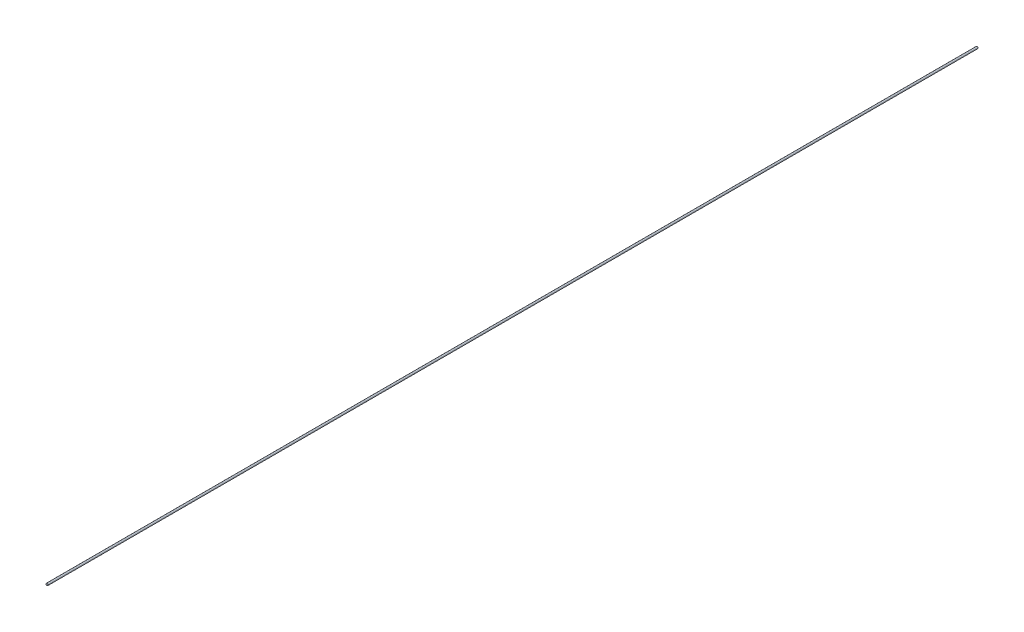
ISO-10303-21;
HEADER;
FILE_DESCRIPTION(('STEP AP214'),'2;1');
FILE_NAME('part.step','',(''),(''),'','','');
FILE_SCHEMA(('AUTOMOTIVE_DESIGN { 1 0 10303 214 1 1 1 1 }'));
ENDSEC;
DATA;
#1=APPLICATION_CONTEXT('core data for automotive mechanical design processes');
#2=APPLICATION_PROTOCOL_DEFINITION('international standard','automotive_design',2000,#1);
#3=PRODUCT_CONTEXT('',#1,'mechanical');
#4=PRODUCT('Part','Part','',(#3));
#5=PRODUCT_RELATED_PRODUCT_CATEGORY('part','',(#4));
#6=PRODUCT_DEFINITION_FORMATION('','',#4);
#7=PRODUCT_DEFINITION_CONTEXT('part definition',#1,'design');
#8=PRODUCT_DEFINITION('design','',#6,#7);
#9=PRODUCT_DEFINITION_SHAPE('','',#8);
#10=(LENGTH_UNIT() NAMED_UNIT(*) SI_UNIT(.MILLI.,.METRE.));
#11=(NAMED_UNIT(*) PLANE_ANGLE_UNIT() SI_UNIT($,.RADIAN.));
#12=(NAMED_UNIT(*) SI_UNIT($,.STERADIAN.) SOLID_ANGLE_UNIT());
#13=UNCERTAINTY_MEASURE_WITH_UNIT(LENGTH_MEASURE(1.E-05),#10,'distance_accuracy_value','');
#14=(GEOMETRIC_REPRESENTATION_CONTEXT(3) GLOBAL_UNCERTAINTY_ASSIGNED_CONTEXT((#13)) GLOBAL_UNIT_ASSIGNED_CONTEXT((#10,
#11,#12)) REPRESENTATION_CONTEXT('',''));
#15=CARTESIAN_POINT('',(0.,0.,0.));
#16=DIRECTION('',(0.,0.,1.));
#17=DIRECTION('',(1.,0.,0.));
#18=AXIS2_PLACEMENT_3D('',#15,#16,#17);
#19=CARTESIAN_POINT('',(0.,0.,2370.));
#20=DIRECTION('',(0.,0.,-1.));
#21=DIRECTION('',(-1.,0.,0.));
#22=AXIS2_PLACEMENT_3D('',#19,#20,#21);
#23=CYLINDRICAL_SURFACE('',#22,5.);
#24=CARTESIAN_POINT('',(0.,0.,2370.));
#25=DIRECTION('',(0.,0.,1.));
#26=DIRECTION('',(1.,0.,0.));
#27=AXIS2_PLACEMENT_3D('',#24,#25,#26);
#28=CIRCLE('',#27,5.);
#29=CARTESIAN_POINT('',(-5.,0.,2370.));
#30=VERTEX_POINT('',#29);
#31=EDGE_CURVE('E10',#30,#30,#28,.T.);
#32=CARTESIAN_POINT('',(0.,0.,-2370.));
#33=DIRECTION('',(0.,0.,1.));
#34=DIRECTION('',(1.,0.,0.));
#35=AXIS2_PLACEMENT_3D('',#32,#33,#34);
#36=CIRCLE('',#35,5.);
#37=CARTESIAN_POINT('',(-5.,0.,-2370.));
#38=VERTEX_POINT('',#37);
#39=EDGE_CURVE('E40',#38,#38,#36,.T.);
#40=CARTESIAN_POINT('',(-5.,0.,2370.));
#41=CARTESIAN_POINT('',(-5.,0.,2320.625));
#42=CARTESIAN_POINT('',(-5.,0.,2271.25));
#43=CARTESIAN_POINT('',(-5.,0.,2172.5));
#44=CARTESIAN_POINT('',(-5.,0.,2123.125));
#45=CARTESIAN_POINT('',(-5.,0.,2024.375));
#46=CARTESIAN_POINT('',(-5.,0.,1975.));
#47=CARTESIAN_POINT('',(-5.,0.,1876.25));
#48=CARTESIAN_POINT('',(-5.,0.,1826.875));
#49=CARTESIAN_POINT('',(-5.,0.,1728.125));
#50=CARTESIAN_POINT('',(-5.,0.,1678.75));
#51=CARTESIAN_POINT('',(-5.,0.,1580.));
#52=CARTESIAN_POINT('',(-5.,0.,1530.625));
#53=CARTESIAN_POINT('',(-5.,0.,1431.875));
#54=CARTESIAN_POINT('',(-5.,0.,1382.5));
#55=CARTESIAN_POINT('',(-5.,0.,1283.75));
#56=CARTESIAN_POINT('',(-5.,0.,1234.375));
#57=CARTESIAN_POINT('',(-5.,0.,1135.625));
#58=CARTESIAN_POINT('',(-5.,0.,1086.25));
#59=CARTESIAN_POINT('',(-5.,0.,987.5));
#60=CARTESIAN_POINT('',(-5.,0.,938.125));
#61=CARTESIAN_POINT('',(-5.,0.,839.374999999999));
#62=CARTESIAN_POINT('',(-5.,0.,789.999999999999));
#63=CARTESIAN_POINT('',(-5.,0.,691.249999999999));
#64=CARTESIAN_POINT('',(-5.,0.,641.874999999999));
#65=CARTESIAN_POINT('',(-5.,0.,543.124999999999));
#66=CARTESIAN_POINT('',(-5.,0.,493.749999999999));
#67=CARTESIAN_POINT('',(-5.,0.,394.999999999999));
#68=CARTESIAN_POINT('',(-5.,0.,345.625));
#69=CARTESIAN_POINT('',(-5.,0.,246.875));
#70=CARTESIAN_POINT('',(-5.,0.,197.5));
#71=CARTESIAN_POINT('',(-5.,0.,98.7499999999998));
#72=CARTESIAN_POINT('',(-5.,0.,49.3749999999996));
#73=CARTESIAN_POINT('',(-5.,0.,-49.3750000000005));
#74=CARTESIAN_POINT('',(-5.,0.,-98.7500000000006));
#75=CARTESIAN_POINT('',(-5.,0.,-197.500000000001));
#76=CARTESIAN_POINT('',(-5.,0.,-246.875000000001));
#77=CARTESIAN_POINT('',(-5.,0.,-345.625000000001));
#78=CARTESIAN_POINT('',(-5.,0.,-395.));
#79=CARTESIAN_POINT('',(-5.,0.,-493.750000000001));
#80=CARTESIAN_POINT('',(-5.,0.,-543.125000000001));
#81=CARTESIAN_POINT('',(-5.,0.,-641.875000000001));
#82=CARTESIAN_POINT('',(-5.,0.,-691.250000000001));
#83=CARTESIAN_POINT('',(-5.,0.,-790.000000000001));
#84=CARTESIAN_POINT('',(-5.,0.,-839.375000000001));
#85=CARTESIAN_POINT('',(-5.,0.,-938.125000000001));
#86=CARTESIAN_POINT('',(-5.,0.,-987.500000000001));
#87=CARTESIAN_POINT('',(-5.,0.,-1086.25));
#88=CARTESIAN_POINT('',(-5.,0.,-1135.625));
#89=CARTESIAN_POINT('',(-5.,0.,-1234.375));
#90=CARTESIAN_POINT('',(-5.,0.,-1283.75));
#91=CARTESIAN_POINT('',(-5.,0.,-1382.5));
#92=CARTESIAN_POINT('',(-5.,0.,-1431.875));
#93=CARTESIAN_POINT('',(-5.,0.,-1530.625));
#94=CARTESIAN_POINT('',(-5.,0.,-1580.));
#95=CARTESIAN_POINT('',(-5.,0.,-1678.75));
#96=CARTESIAN_POINT('',(-5.,0.,-1728.125));
#97=CARTESIAN_POINT('',(-5.,0.,-1826.875));
#98=CARTESIAN_POINT('',(-5.,0.,-1876.25));
#99=CARTESIAN_POINT('',(-5.,0.,-1975.));
#100=CARTESIAN_POINT('',(-5.,0.,-2024.375));
#101=CARTESIAN_POINT('',(-5.,0.,-2123.125));
#102=CARTESIAN_POINT('',(-5.,0.,-2172.5));
#103=CARTESIAN_POINT('',(-5.,0.,-2271.25));
#104=CARTESIAN_POINT('',(-5.,0.,-2320.625));
#105=CARTESIAN_POINT('',(-5.,0.,-2370.));
#106=B_SPLINE_CURVE_WITH_KNOTS('',3,(#40,#41,#42,#43,#44,#45,#46,#47,#48,#49,#50,#51,#52,#53,
#54,#55,#56,#57,#58,#59,#60,#61,#62,#63,#64,#65,#66,#67,#68,#69,#70,#71,#72,#73,#74,#75,#76,#77,
#78,#79,#80,#81,#82,#83,#84,#85,#86,#87,#88,#89,#90,#91,#92,#93,#94,#95,#96,#97,#98,#99,#100,
#101,#102,#103,#104,#105),.UNSPECIFIED.,.F.,.F.,(4,2,2,2,2,2,2,2,2,2,2,2,2,2,2,2,2,2,2,2,2,2,2,
2,2,2,2,2,2,2,2,2,4),(0.,148.125,296.25,444.375,592.5,740.625000000001,888.75,1036.875,1185.,
1333.125,1481.25,1629.375,1777.5,1925.625,2073.75,2221.875,2370.,2518.125,2666.25,2814.375,
2962.5,3110.625,3258.75,3406.875,3555.,3703.125,3851.25,3999.375,4147.5,4295.625,4443.75,
4591.875,4740.),.UNSPECIFIED.);
#107=EDGE_CURVE('BSEAM37',#30,#38,#106,.T.);
#108=ORIENTED_EDGE('',*,*,#31,.F.);
#109=ORIENTED_EDGE('',*,*,#39,.T.);
#110=ORIENTED_EDGE('',*,*,#107,.T.);
#111=ORIENTED_EDGE('',*,*,#107,.F.);
#112=EDGE_LOOP('',(#108,#110,#109,#111));
#113=FACE_BOUND('',#112,.T.);
#114=ADVANCED_FACE('F37',(#113),#23,.T.);
#115=CARTESIAN_POINT('',(0.,0.,2370.));
#116=DIRECTION('',(0.,0.,1.));
#117=DIRECTION('',(1.,0.,0.));
#118=AXIS2_PLACEMENT_3D('',#115,#116,#117);
#119=PLANE('',#118);
#120=ORIENTED_EDGE('',*,*,#31,.T.);
#121=EDGE_LOOP('',(#120));
#122=FACE_BOUND('',#121,.T.);
#123=ADVANCED_FACE('F54',(#122),#119,.T.);
#124=CARTESIAN_POINT('',(0.,0.,-2370.));
#125=DIRECTION('',(0.,0.,1.));
#126=DIRECTION('',(1.,0.,0.));
#127=AXIS2_PLACEMENT_3D('',#124,#125,#126);
#128=PLANE('',#127);
#129=ORIENTED_EDGE('',*,*,#39,.F.);
#130=EDGE_LOOP('',(#129));
#131=FACE_BOUND('',#130,.T.);
#132=ADVANCED_FACE('F52',(#131),#128,.F.);
#133=CLOSED_SHELL('',(#114,#123,#132));
#134=MANIFOLD_SOLID_BREP('B2',#133);
#135=ADVANCED_BREP_SHAPE_REPRESENTATION('',(#18,#134),#14);
#136=SHAPE_DEFINITION_REPRESENTATION(#9,#135);
ENDSEC;
END-ISO-10303-21;
